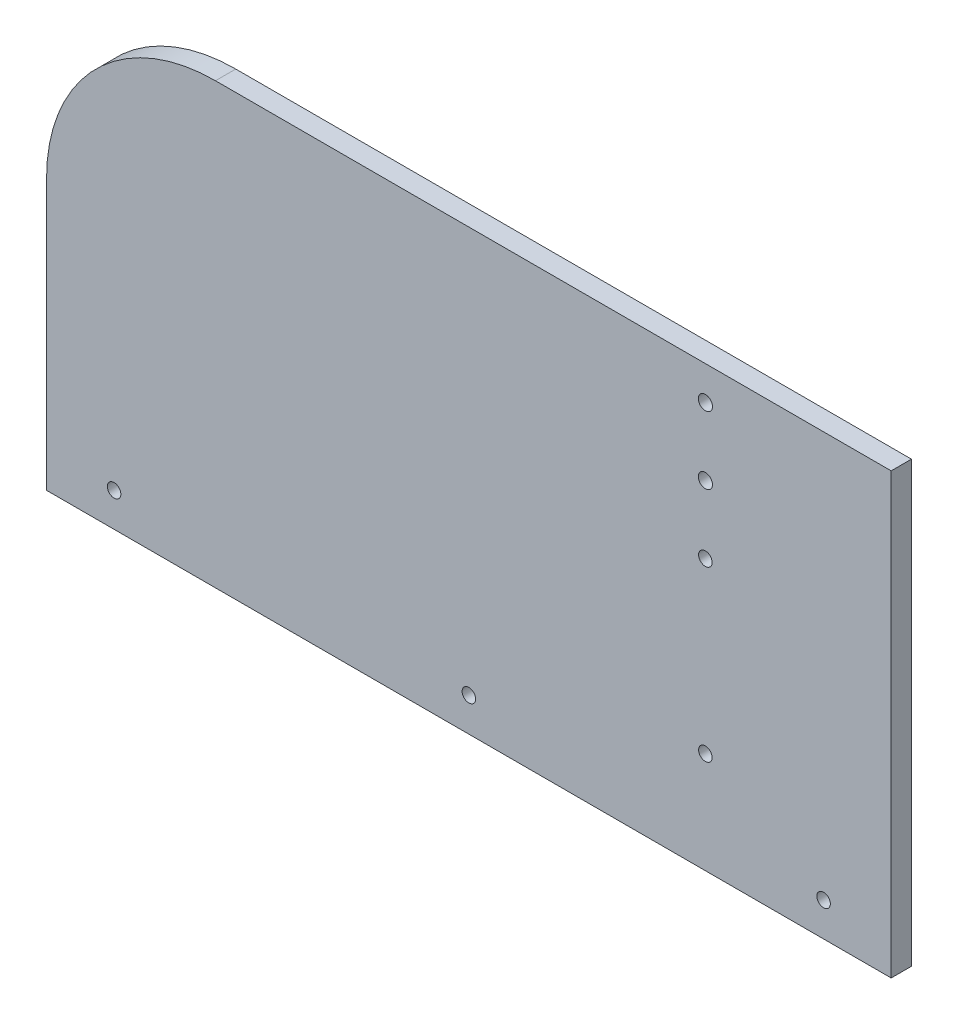
ISO-10303-21;
HEADER;
FILE_DESCRIPTION(('STEP AP214'),'2;1');
FILE_NAME('part.step','',(''),(''),'','','');
FILE_SCHEMA(('AUTOMOTIVE_DESIGN { 1 0 10303 214 1 1 1 1 }'));
ENDSEC;
DATA;
#1=APPLICATION_CONTEXT('core data for automotive mechanical design processes');
#2=APPLICATION_PROTOCOL_DEFINITION('international standard','automotive_design',2000,#1);
#3=PRODUCT_CONTEXT('',#1,'mechanical');
#4=PRODUCT('Part','Part','',(#3));
#5=PRODUCT_RELATED_PRODUCT_CATEGORY('part','',(#4));
#6=PRODUCT_DEFINITION_FORMATION('','',#4);
#7=PRODUCT_DEFINITION_CONTEXT('part definition',#1,'design');
#8=PRODUCT_DEFINITION('design','',#6,#7);
#9=PRODUCT_DEFINITION_SHAPE('','',#8);
#10=(LENGTH_UNIT() NAMED_UNIT(*) SI_UNIT(.MILLI.,.METRE.));
#11=(NAMED_UNIT(*) PLANE_ANGLE_UNIT() SI_UNIT($,.RADIAN.));
#12=(NAMED_UNIT(*) SI_UNIT($,.STERADIAN.) SOLID_ANGLE_UNIT());
#13=UNCERTAINTY_MEASURE_WITH_UNIT(LENGTH_MEASURE(1.E-05),#10,'distance_accuracy_value','');
#14=(GEOMETRIC_REPRESENTATION_CONTEXT(3) GLOBAL_UNCERTAINTY_ASSIGNED_CONTEXT((#13)) GLOBAL_UNIT_ASSIGNED_CONTEXT((#10,
#11,#12)) REPRESENTATION_CONTEXT('',''));
#15=CARTESIAN_POINT('',(0.,0.,0.));
#16=DIRECTION('',(0.,0.,1.));
#17=DIRECTION('',(1.,0.,0.));
#18=AXIS2_PLACEMENT_3D('',#15,#16,#17);
#19=CARTESIAN_POINT('',(125.,65.,6.));
#20=DIRECTION('',(-1.,0.,0.));
#21=DIRECTION('',(0.,-1.,0.));
#22=AXIS2_PLACEMENT_3D('',#19,#20,#21);
#23=PLANE('',#22);
#24=DIRECTION('',(0.,1.,0.));
#25=VECTOR('',#24,1.);
#26=CARTESIAN_POINT('',(125.,65.,0.));
#27=LINE('',#26,#25);
#28=CARTESIAN_POINT('',(125.,-65.,0.));
#29=VERTEX_POINT('',#28);
#30=CARTESIAN_POINT('',(125.,65.,0.));
#31=VERTEX_POINT('',#30);
#32=EDGE_CURVE('E98',#29,#31,#27,.T.);
#33=ORIENTED_EDGE('',*,*,#32,.T.);
#34=DIRECTION('',(0.,0.,-1.));
#35=VECTOR('',#34,1.);
#36=CARTESIAN_POINT('',(125.,65.,6.));
#37=LINE('',#36,#35);
#38=CARTESIAN_POINT('',(125.,65.,6.));
#39=VERTEX_POINT('',#38);
#40=EDGE_CURVE('E81',#39,#31,#37,.T.);
#41=ORIENTED_EDGE('',*,*,#40,.F.);
#42=DIRECTION('',(0.,1.,0.));
#43=VECTOR('',#42,1.);
#44=CARTESIAN_POINT('',(125.,65.,6.));
#45=LINE('',#44,#43);
#46=CARTESIAN_POINT('',(125.,-65.,6.));
#47=VERTEX_POINT('',#46);
#48=EDGE_CURVE('E86',#47,#39,#45,.T.);
#49=ORIENTED_EDGE('',*,*,#48,.F.);
#50=DIRECTION('',(0.,0.,-1.));
#51=VECTOR('',#50,1.);
#52=CARTESIAN_POINT('',(125.,-65.,6.));
#53=LINE('',#52,#51);
#54=EDGE_CURVE('E105',#47,#29,#53,.T.);
#55=ORIENTED_EDGE('',*,*,#54,.T.);
#56=EDGE_LOOP('',(#33,#41,#49,#55));
#57=FACE_BOUND('',#56,.T.);
#58=ADVANCED_FACE('F32',(#57),#23,.F.);
#59=CARTESIAN_POINT('',(-125.,65.,6.));
#60=DIRECTION('',(0.,-1.,0.));
#61=DIRECTION('',(0.,0.,-1.));
#62=AXIS2_PLACEMENT_3D('',#59,#60,#61);
#63=PLANE('',#62);
#64=DIRECTION('',(-1.,0.,0.));
#65=VECTOR('',#64,1.);
#66=CARTESIAN_POINT('',(-125.,65.,0.));
#67=LINE('',#66,#65);
#68=CARTESIAN_POINT('',(-74.9999999999999,65.,0.));
#69=VERTEX_POINT('',#68);
#70=EDGE_CURVE('E235',#31,#69,#67,.T.);
#71=ORIENTED_EDGE('',*,*,#70,.T.);
#72=DIRECTION('',(0.,0.,-1.));
#73=VECTOR('',#72,1.);
#74=CARTESIAN_POINT('',(-74.9999999999999,65.,6.));
#75=LINE('',#74,#73);
#76=CARTESIAN_POINT('',(-74.9999999999999,65.,6.));
#77=VERTEX_POINT('',#76);
#78=EDGE_CURVE('E47',#69,#77,#75,.F.);
#79=ORIENTED_EDGE('',*,*,#78,.T.);
#80=DIRECTION('',(-1.,0.,0.));
#81=VECTOR('',#80,1.);
#82=CARTESIAN_POINT('',(-125.,65.,6.));
#83=LINE('',#82,#81);
#84=EDGE_CURVE('E77',#39,#77,#83,.T.);
#85=ORIENTED_EDGE('',*,*,#84,.F.);
#86=ORIENTED_EDGE('',*,*,#40,.T.);
#87=EDGE_LOOP('',(#71,#79,#85,#86));
#88=FACE_BOUND('',#87,.T.);
#89=ADVANCED_FACE('F79',(#88),#63,.F.);
#90=CARTESIAN_POINT('',(-125.,65.,6.));
#91=DIRECTION('',(1.,0.,0.));
#92=DIRECTION('',(0.,1.,0.));
#93=AXIS2_PLACEMENT_3D('',#90,#91,#92);
#94=PLANE('',#93);
#95=DIRECTION('',(0.,-1.,0.));
#96=VECTOR('',#95,1.);
#97=CARTESIAN_POINT('',(-125.,65.,6.));
#98=LINE('',#97,#96);
#99=CARTESIAN_POINT('',(-125.,15.,6.));
#100=VERTEX_POINT('',#99);
#101=CARTESIAN_POINT('',(-125.,-65.,6.));
#102=VERTEX_POINT('',#101);
#103=EDGE_CURVE('E85',#100,#102,#98,.T.);
#104=ORIENTED_EDGE('',*,*,#103,.F.);
#105=DIRECTION('',(0.,0.,-1.));
#106=VECTOR('',#105,1.);
#107=CARTESIAN_POINT('',(-125.,15.,6.));
#108=LINE('',#107,#106);
#109=CARTESIAN_POINT('',(-125.,15.,0.));
#110=VERTEX_POINT('',#109);
#111=EDGE_CURVE('E99',#100,#110,#108,.T.);
#112=ORIENTED_EDGE('',*,*,#111,.T.);
#113=DIRECTION('',(0.,-1.,0.));
#114=VECTOR('',#113,1.);
#115=CARTESIAN_POINT('',(-125.,65.,0.));
#116=LINE('',#115,#114);
#117=CARTESIAN_POINT('',(-125.,-65.,0.));
#118=VERTEX_POINT('',#117);
#119=EDGE_CURVE('E237',#110,#118,#116,.T.);
#120=ORIENTED_EDGE('',*,*,#119,.T.);
#121=DIRECTION('',(0.,0.,-1.));
#122=VECTOR('',#121,1.);
#123=CARTESIAN_POINT('',(-125.,-65.,6.));
#124=LINE('',#123,#122);
#125=EDGE_CURVE('E100',#102,#118,#124,.T.);
#126=ORIENTED_EDGE('',*,*,#125,.F.);
#127=EDGE_LOOP('',(#104,#112,#120,#126));
#128=FACE_BOUND('',#127,.T.);
#129=ADVANCED_FACE('F172',(#128),#94,.F.);
#130=CARTESIAN_POINT('',(-125.,-65.,6.));
#131=DIRECTION('',(0.,1.,0.));
#132=DIRECTION('',(0.,0.,1.));
#133=AXIS2_PLACEMENT_3D('',#130,#131,#132);
#134=PLANE('',#133);
#135=DIRECTION('',(1.,0.,0.));
#136=VECTOR('',#135,1.);
#137=CARTESIAN_POINT('',(-125.,-65.,0.));
#138=LINE('',#137,#136);
#139=EDGE_CURVE('E95',#118,#29,#138,.T.);
#140=ORIENTED_EDGE('',*,*,#139,.T.);
#141=ORIENTED_EDGE('',*,*,#54,.F.);
#142=DIRECTION('',(1.,0.,0.));
#143=VECTOR('',#142,1.);
#144=CARTESIAN_POINT('',(-125.,-65.,6.));
#145=LINE('',#144,#143);
#146=EDGE_CURVE('E91',#102,#47,#145,.T.);
#147=ORIENTED_EDGE('',*,*,#146,.F.);
#148=ORIENTED_EDGE('',*,*,#125,.T.);
#149=EDGE_LOOP('',(#140,#141,#147,#148));
#150=FACE_BOUND('',#149,.T.);
#151=ADVANCED_FACE('F245',(#150),#134,.F.);
#152=CARTESIAN_POINT('',(0.,0.,6.));
#153=DIRECTION('',(0.,0.,1.));
#154=DIRECTION('',(1.,0.,0.));
#155=AXIS2_PLACEMENT_3D('',#152,#153,#154);
#156=PLANE('',#155);
#157=CARTESIAN_POINT('',(70.0000000000001,15.0000000000001,6.));
#158=DIRECTION('',(0.,0.,1.));
#159=DIRECTION('',(1.,0.,0.));
#160=AXIS2_PLACEMENT_3D('',#157,#158,#159);
#161=CIRCLE('',#160,2.);
#162=CARTESIAN_POINT('',(72.0000000000001,15.0000000000001,6.));
#163=VERTEX_POINT('',#162);
#164=EDGE_CURVE('E212',#163,#163,#161,.F.);
#165=ORIENTED_EDGE('',*,*,#164,.T.);
#166=EDGE_LOOP('',(#165));
#167=FACE_BOUND('',#166,.T.);
#168=CARTESIAN_POINT('',(70.0000000000001,-34.9999999999999,6.));
#169=DIRECTION('',(0.,0.,1.));
#170=DIRECTION('',(1.,0.,0.));
#171=AXIS2_PLACEMENT_3D('',#168,#169,#170);
#172=CIRCLE('',#171,2.);
#173=CARTESIAN_POINT('',(72.0000000000001,-34.9999999999999,6.));
#174=VERTEX_POINT('',#173);
#175=EDGE_CURVE('E210',#174,#174,#172,.F.);
#176=ORIENTED_EDGE('',*,*,#175,.T.);
#177=EDGE_LOOP('',(#176));
#178=FACE_BOUND('',#177,.T.);
#179=CARTESIAN_POINT('',(70.0000000000001,55.0000000000001,6.));
#180=DIRECTION('',(0.,0.,1.));
#181=DIRECTION('',(1.,0.,0.));
#182=AXIS2_PLACEMENT_3D('',#179,#180,#181);
#183=CIRCLE('',#182,2.09999999999999);
#184=CARTESIAN_POINT('',(72.1000000000001,55.0000000000001,6.));
#185=VERTEX_POINT('',#184);
#186=EDGE_CURVE('E218',#185,#185,#183,.F.);
#187=ORIENTED_EDGE('',*,*,#186,.T.);
#188=EDGE_LOOP('',(#187));
#189=FACE_BOUND('',#188,.T.);
#190=CARTESIAN_POINT('',(70.0000000000001,35.0000000000001,6.));
#191=DIRECTION('',(0.,0.,1.));
#192=DIRECTION('',(1.,0.,0.));
#193=AXIS2_PLACEMENT_3D('',#190,#191,#192);
#194=CIRCLE('',#193,2.09999999999999);
#195=CARTESIAN_POINT('',(72.1000000000001,35.0000000000001,6.));
#196=VERTEX_POINT('',#195);
#197=EDGE_CURVE('E215',#196,#196,#194,.F.);
#198=ORIENTED_EDGE('',*,*,#197,.T.);
#199=EDGE_LOOP('',(#198));
#200=FACE_BOUND('',#199,.T.);
#201=CARTESIAN_POINT('',(-105.,-55.,6.));
#202=DIRECTION('',(0.,0.,1.));
#203=DIRECTION('',(1.,0.,0.));
#204=AXIS2_PLACEMENT_3D('',#201,#202,#203);
#205=CIRCLE('',#204,2.);
#206=CARTESIAN_POINT('',(-103.,-55.,6.));
#207=VERTEX_POINT('',#206);
#208=EDGE_CURVE('E224',#207,#207,#205,.F.);
#209=ORIENTED_EDGE('',*,*,#208,.T.);
#210=EDGE_LOOP('',(#209));
#211=FACE_BOUND('',#210,.T.);
#212=CARTESIAN_POINT('',(0.,-55.,6.));
#213=DIRECTION('',(0.,0.,1.));
#214=DIRECTION('',(1.,0.,0.));
#215=AXIS2_PLACEMENT_3D('',#212,#213,#214);
#216=CIRCLE('',#215,2.);
#217=CARTESIAN_POINT('',(2.0000000000001,-55.,6.));
#218=VERTEX_POINT('',#217);
#219=EDGE_CURVE('E227',#218,#218,#216,.F.);
#220=ORIENTED_EDGE('',*,*,#219,.T.);
#221=EDGE_LOOP('',(#220));
#222=FACE_BOUND('',#221,.T.);
#223=CARTESIAN_POINT('',(105.,-55.,6.));
#224=DIRECTION('',(0.,0.,1.));
#225=DIRECTION('',(1.,0.,0.));
#226=AXIS2_PLACEMENT_3D('',#223,#224,#225);
#227=CIRCLE('',#226,2.);
#228=CARTESIAN_POINT('',(107.,-55.,6.));
#229=VERTEX_POINT('',#228);
#230=EDGE_CURVE('E221',#229,#229,#227,.F.);
#231=ORIENTED_EDGE('',*,*,#230,.T.);
#232=EDGE_LOOP('',(#231));
#233=FACE_BOUND('',#232,.T.);
#234=ORIENTED_EDGE('',*,*,#84,.T.);
#235=CARTESIAN_POINT('',(-74.9999999999999,15.,6.));
#236=DIRECTION('',(0.,0.,1.));
#237=DIRECTION('',(1.,0.,0.));
#238=AXIS2_PLACEMENT_3D('',#235,#236,#237);
#239=CIRCLE('',#238,50.);
#240=EDGE_CURVE('E111',#77,#100,#239,.T.);
#241=ORIENTED_EDGE('',*,*,#240,.T.);
#242=ORIENTED_EDGE('',*,*,#103,.T.);
#243=ORIENTED_EDGE('',*,*,#146,.T.);
#244=ORIENTED_EDGE('',*,*,#48,.T.);
#245=EDGE_LOOP('',(#234,#241,#242,#243,#244));
#246=FACE_BOUND('',#245,.T.);
#247=ADVANCED_FACE('F89',(#167,#178,#189,#200,#211,#222,#233,#246),#156,.T.);
#248=CARTESIAN_POINT('',(0.,0.,0.));
#249=DIRECTION('',(0.,0.,1.));
#250=DIRECTION('',(1.,0.,0.));
#251=AXIS2_PLACEMENT_3D('',#248,#249,#250);
#252=PLANE('',#251);
#253=CARTESIAN_POINT('',(-105.,-55.,0.));
#254=DIRECTION('',(0.,0.,1.));
#255=DIRECTION('',(1.,0.,0.));
#256=AXIS2_PLACEMENT_3D('',#253,#254,#255);
#257=CIRCLE('',#256,4.3);
#258=CARTESIAN_POINT('',(-100.7,-55.,0.));
#259=VERTEX_POINT('',#258);
#260=EDGE_CURVE('E134',#259,#259,#257,.T.);
#261=ORIENTED_EDGE('',*,*,#260,.T.);
#262=EDGE_LOOP('',(#261));
#263=FACE_BOUND('',#262,.T.);
#264=CARTESIAN_POINT('',(0.,-55.,0.));
#265=DIRECTION('',(0.,0.,1.));
#266=DIRECTION('',(1.,0.,0.));
#267=AXIS2_PLACEMENT_3D('',#264,#265,#266);
#268=CIRCLE('',#267,4.3);
#269=CARTESIAN_POINT('',(4.3000000000001,-55.,0.));
#270=VERTEX_POINT('',#269);
#271=EDGE_CURVE('E131',#270,#270,#268,.T.);
#272=ORIENTED_EDGE('',*,*,#271,.T.);
#273=EDGE_LOOP('',(#272));
#274=FACE_BOUND('',#273,.T.);
#275=CARTESIAN_POINT('',(105.,-55.,0.));
#276=DIRECTION('',(0.,0.,1.));
#277=DIRECTION('',(1.,0.,0.));
#278=AXIS2_PLACEMENT_3D('',#275,#276,#277);
#279=CIRCLE('',#278,4.3);
#280=CARTESIAN_POINT('',(109.3,-55.,0.));
#281=VERTEX_POINT('',#280);
#282=EDGE_CURVE('E128',#281,#281,#279,.T.);
#283=ORIENTED_EDGE('',*,*,#282,.T.);
#284=EDGE_LOOP('',(#283));
#285=FACE_BOUND('',#284,.T.);
#286=CARTESIAN_POINT('',(70.0000000000001,-34.9999999999999,0.));
#287=DIRECTION('',(0.,0.,1.));
#288=DIRECTION('',(1.,0.,0.));
#289=AXIS2_PLACEMENT_3D('',#286,#287,#288);
#290=CIRCLE('',#289,4.29999999999997);
#291=CARTESIAN_POINT('',(74.3000000000001,-34.9999999999999,0.));
#292=VERTEX_POINT('',#291);
#293=EDGE_CURVE('E125',#292,#292,#290,.T.);
#294=ORIENTED_EDGE('',*,*,#293,.T.);
#295=EDGE_LOOP('',(#294));
#296=FACE_BOUND('',#295,.T.);
#297=CARTESIAN_POINT('',(70.0000000000001,15.0000000000001,0.));
#298=DIRECTION('',(0.,0.,1.));
#299=DIRECTION('',(1.,0.,0.));
#300=AXIS2_PLACEMENT_3D('',#297,#298,#299);
#301=CIRCLE('',#300,4.29999999999997);
#302=CARTESIAN_POINT('',(74.3000000000001,15.0000000000001,0.));
#303=VERTEX_POINT('',#302);
#304=EDGE_CURVE('E122',#303,#303,#301,.T.);
#305=ORIENTED_EDGE('',*,*,#304,.T.);
#306=EDGE_LOOP('',(#305));
#307=FACE_BOUND('',#306,.T.);
#308=CARTESIAN_POINT('',(70.0000000000001,35.0000000000001,0.));
#309=DIRECTION('',(0.,0.,1.));
#310=DIRECTION('',(1.,0.,0.));
#311=AXIS2_PLACEMENT_3D('',#308,#309,#310);
#312=CIRCLE('',#311,4.39999999999999);
#313=CARTESIAN_POINT('',(74.4000000000001,35.0000000000001,0.));
#314=VERTEX_POINT('',#313);
#315=EDGE_CURVE('E119',#314,#314,#312,.T.);
#316=ORIENTED_EDGE('',*,*,#315,.T.);
#317=EDGE_LOOP('',(#316));
#318=FACE_BOUND('',#317,.T.);
#319=CARTESIAN_POINT('',(70.0000000000001,55.0000000000001,0.));
#320=DIRECTION('',(0.,0.,1.));
#321=DIRECTION('',(1.,0.,0.));
#322=AXIS2_PLACEMENT_3D('',#319,#320,#321);
#323=CIRCLE('',#322,4.39999999999999);
#324=CARTESIAN_POINT('',(74.4000000000001,55.0000000000001,0.));
#325=VERTEX_POINT('',#324);
#326=EDGE_CURVE('E116',#325,#325,#323,.T.);
#327=ORIENTED_EDGE('',*,*,#326,.T.);
#328=EDGE_LOOP('',(#327));
#329=FACE_BOUND('',#328,.T.);
#330=ORIENTED_EDGE('',*,*,#119,.F.);
#331=CARTESIAN_POINT('',(-74.9999999999999,15.,0.));
#332=DIRECTION('',(0.,0.,1.));
#333=DIRECTION('',(1.,0.,0.));
#334=AXIS2_PLACEMENT_3D('',#331,#332,#333);
#335=CIRCLE('',#334,50.);
#336=EDGE_CURVE('E55',#110,#69,#335,.F.);
#337=ORIENTED_EDGE('',*,*,#336,.T.);
#338=ORIENTED_EDGE('',*,*,#70,.F.);
#339=ORIENTED_EDGE('',*,*,#32,.F.);
#340=ORIENTED_EDGE('',*,*,#139,.F.);
#341=EDGE_LOOP('',(#330,#337,#338,#339,#340));
#342=FACE_BOUND('',#341,.T.);
#343=ADVANCED_FACE('F180',(#263,#274,#285,#296,#307,#318,#329,#342),#252,.F.);
#344=CARTESIAN_POINT('',(-74.9999999999999,15.,6.));
#345=DIRECTION('',(0.,0.,-1.));
#346=DIRECTION('',(-1.,0.,0.));
#347=AXIS2_PLACEMENT_3D('',#344,#345,#346);
#348=CYLINDRICAL_SURFACE('',#347,50.);
#349=ORIENTED_EDGE('',*,*,#240,.F.);
#350=ORIENTED_EDGE('',*,*,#78,.F.);
#351=ORIENTED_EDGE('',*,*,#336,.F.);
#352=ORIENTED_EDGE('',*,*,#111,.F.);
#353=EDGE_LOOP('',(#349,#350,#351,#352));
#354=FACE_BOUND('',#353,.T.);
#355=ADVANCED_FACE('F176',(#354),#348,.T.);
#356=CARTESIAN_POINT('',(105.,-55.,11.6568542494924));
#357=DIRECTION('',(0.,0.,-1.));
#358=DIRECTION('',(-1.,0.,0.));
#359=AXIS2_PLACEMENT_3D('',#356,#357,#358);
#360=CYLINDRICAL_SURFACE('',#359,2.);
#361=CARTESIAN_POINT('',(105.,-55.,2.30000000000001));
#362=DIRECTION('',(0.,0.,1.));
#363=DIRECTION('',(1.,0.,0.));
#364=AXIS2_PLACEMENT_3D('',#361,#362,#363);
#365=CIRCLE('',#364,2.);
#366=CARTESIAN_POINT('',(107.,-55.,2.30000000000001));
#367=VERTEX_POINT('',#366);
#368=EDGE_CURVE('E140',#367,#367,#365,.F.);
#369=ORIENTED_EDGE('',*,*,#368,.T.);
#370=EDGE_LOOP('',(#369));
#371=FACE_BOUND('',#370,.T.);
#372=ORIENTED_EDGE('',*,*,#230,.F.);
#373=EDGE_LOOP('',(#372));
#374=FACE_BOUND('',#373,.T.);
#375=ADVANCED_FACE('F179',(#371,#374),#360,.F.);
#376=CARTESIAN_POINT('',(0.,-55.,11.6568542494924));
#377=DIRECTION('',(0.,0.,-1.));
#378=DIRECTION('',(-1.,0.,0.));
#379=AXIS2_PLACEMENT_3D('',#376,#377,#378);
#380=CYLINDRICAL_SURFACE('',#379,2.);
#381=CARTESIAN_POINT('',(0.,-55.,2.30000000000001));
#382=DIRECTION('',(0.,0.,1.));
#383=DIRECTION('',(1.,0.,0.));
#384=AXIS2_PLACEMENT_3D('',#381,#382,#383);
#385=CIRCLE('',#384,2.);
#386=CARTESIAN_POINT('',(2.0000000000001,-55.,2.30000000000001));
#387=VERTEX_POINT('',#386);
#388=EDGE_CURVE('E137',#387,#387,#385,.F.);
#389=ORIENTED_EDGE('',*,*,#388,.T.);
#390=EDGE_LOOP('',(#389));
#391=FACE_BOUND('',#390,.T.);
#392=ORIENTED_EDGE('',*,*,#219,.F.);
#393=EDGE_LOOP('',(#392));
#394=FACE_BOUND('',#393,.T.);
#395=ADVANCED_FACE('F260',(#391,#394),#380,.F.);
#396=CARTESIAN_POINT('',(-105.,-55.,11.6568542494924));
#397=DIRECTION('',(0.,0.,-1.));
#398=DIRECTION('',(-1.,0.,0.));
#399=AXIS2_PLACEMENT_3D('',#396,#397,#398);
#400=CYLINDRICAL_SURFACE('',#399,2.);
#401=CARTESIAN_POINT('',(-105.,-55.,2.30000000000001));
#402=DIRECTION('',(0.,0.,1.));
#403=DIRECTION('',(1.,0.,0.));
#404=AXIS2_PLACEMENT_3D('',#401,#402,#403);
#405=CIRCLE('',#404,2.);
#406=CARTESIAN_POINT('',(-103.,-55.,2.30000000000001));
#407=VERTEX_POINT('',#406);
#408=EDGE_CURVE('E113',#407,#407,#405,.F.);
#409=ORIENTED_EDGE('',*,*,#408,.T.);
#410=EDGE_LOOP('',(#409));
#411=FACE_BOUND('',#410,.T.);
#412=ORIENTED_EDGE('',*,*,#208,.F.);
#413=EDGE_LOOP('',(#412));
#414=FACE_BOUND('',#413,.T.);
#415=ADVANCED_FACE('F264',(#411,#414),#400,.F.);
#416=CARTESIAN_POINT('',(70.0000000000001,35.0000000000001,11.939696961967));
#417=DIRECTION('',(0.,0.,-1.));
#418=DIRECTION('',(-1.,0.,0.));
#419=AXIS2_PLACEMENT_3D('',#416,#417,#418);
#420=CYLINDRICAL_SURFACE('',#419,2.09999999999999);
#421=CARTESIAN_POINT('',(70.0000000000001,35.0000000000001,2.30000000000001));
#422=DIRECTION('',(0.,0.,1.));
#423=DIRECTION('',(1.,0.,0.));
#424=AXIS2_PLACEMENT_3D('',#421,#422,#423);
#425=CIRCLE('',#424,2.09999999999999);
#426=CARTESIAN_POINT('',(72.1000000000001,35.0000000000001,2.30000000000001));
#427=VERTEX_POINT('',#426);
#428=EDGE_CURVE('E40',#427,#427,#425,.F.);
#429=ORIENTED_EDGE('',*,*,#428,.T.);
#430=EDGE_LOOP('',(#429));
#431=FACE_BOUND('',#430,.T.);
#432=ORIENTED_EDGE('',*,*,#197,.F.);
#433=EDGE_LOOP('',(#432));
#434=FACE_BOUND('',#433,.T.);
#435=ADVANCED_FACE('F151',(#431,#434),#420,.F.);
#436=CARTESIAN_POINT('',(70.0000000000001,55.0000000000001,11.939696961967));
#437=DIRECTION('',(0.,0.,-1.));
#438=DIRECTION('',(-1.,0.,0.));
#439=AXIS2_PLACEMENT_3D('',#436,#437,#438);
#440=CYLINDRICAL_SURFACE('',#439,2.09999999999999);
#441=CARTESIAN_POINT('',(70.0000000000001,55.0000000000001,2.30000000000001));
#442=DIRECTION('',(0.,0.,1.));
#443=DIRECTION('',(1.,0.,0.));
#444=AXIS2_PLACEMENT_3D('',#441,#442,#443);
#445=CIRCLE('',#444,2.09999999999999);
#446=CARTESIAN_POINT('',(72.1000000000001,55.0000000000001,2.30000000000001));
#447=VERTEX_POINT('',#446);
#448=EDGE_CURVE('E11',#447,#447,#445,.F.);
#449=ORIENTED_EDGE('',*,*,#448,.T.);
#450=EDGE_LOOP('',(#449));
#451=FACE_BOUND('',#450,.T.);
#452=ORIENTED_EDGE('',*,*,#186,.F.);
#453=EDGE_LOOP('',(#452));
#454=FACE_BOUND('',#453,.T.);
#455=ADVANCED_FACE('F206',(#451,#454),#440,.F.);
#456=CARTESIAN_POINT('',(70.0000000000001,-34.9999999999999,11.6568542494924));
#457=DIRECTION('',(0.,0.,-1.));
#458=DIRECTION('',(-1.,0.,0.));
#459=AXIS2_PLACEMENT_3D('',#456,#457,#458);
#460=CYLINDRICAL_SURFACE('',#459,2.);
#461=CARTESIAN_POINT('',(70.0000000000001,-34.9999999999999,2.29999999999995));
#462=DIRECTION('',(0.,0.,1.));
#463=DIRECTION('',(1.,0.,0.));
#464=AXIS2_PLACEMENT_3D('',#461,#462,#463);
#465=CIRCLE('',#464,2.);
#466=CARTESIAN_POINT('',(72.0000000000001,-34.9999999999999,2.29999999999995));
#467=VERTEX_POINT('',#466);
#468=EDGE_CURVE('E143',#467,#467,#465,.F.);
#469=ORIENTED_EDGE('',*,*,#468,.T.);
#470=EDGE_LOOP('',(#469));
#471=FACE_BOUND('',#470,.T.);
#472=ORIENTED_EDGE('',*,*,#175,.F.);
#473=EDGE_LOOP('',(#472));
#474=FACE_BOUND('',#473,.T.);
#475=ADVANCED_FACE('F203',(#471,#474),#460,.F.);
#476=CARTESIAN_POINT('',(70.0000000000001,15.0000000000001,11.6568542494924));
#477=DIRECTION('',(0.,0.,-1.));
#478=DIRECTION('',(-1.,0.,0.));
#479=AXIS2_PLACEMENT_3D('',#476,#477,#478);
#480=CYLINDRICAL_SURFACE('',#479,2.);
#481=CARTESIAN_POINT('',(70.0000000000001,15.0000000000001,2.29999999999995));
#482=DIRECTION('',(0.,0.,1.));
#483=DIRECTION('',(1.,0.,0.));
#484=AXIS2_PLACEMENT_3D('',#481,#482,#483);
#485=CIRCLE('',#484,2.);
#486=CARTESIAN_POINT('',(72.0000000000001,15.0000000000001,2.29999999999995));
#487=VERTEX_POINT('',#486);
#488=EDGE_CURVE('E146',#487,#487,#485,.F.);
#489=ORIENTED_EDGE('',*,*,#488,.T.);
#490=EDGE_LOOP('',(#489));
#491=FACE_BOUND('',#490,.T.);
#492=ORIENTED_EDGE('',*,*,#164,.F.);
#493=EDGE_LOOP('',(#492));
#494=FACE_BOUND('',#493,.T.);
#495=ADVANCED_FACE('F186',(#491,#494),#480,.F.);
#496=CARTESIAN_POINT('',(-105.,-55.,2.30000000000001));
#497=DIRECTION('',(0.,0.,-1.));
#498=DIRECTION('',(-1.,0.,0.));
#499=AXIS2_PLACEMENT_3D('',#496,#497,#498);
#500=CONICAL_SURFACE('',#499,2.,0.785398163397447);
#501=ORIENTED_EDGE('',*,*,#260,.F.);
#502=EDGE_LOOP('',(#501));
#503=FACE_BOUND('',#502,.T.);
#504=ORIENTED_EDGE('',*,*,#408,.F.);
#505=EDGE_LOOP('',(#504));
#506=FACE_BOUND('',#505,.T.);
#507=ADVANCED_FACE('F182',(#503,#506),#500,.F.);
#508=CARTESIAN_POINT('',(0.,-55.,2.30000000000001));
#509=DIRECTION('',(0.,0.,-1.));
#510=DIRECTION('',(-1.,0.,0.));
#511=AXIS2_PLACEMENT_3D('',#508,#509,#510);
#512=CONICAL_SURFACE('',#511,2.,0.785398163397447);
#513=ORIENTED_EDGE('',*,*,#271,.F.);
#514=EDGE_LOOP('',(#513));
#515=FACE_BOUND('',#514,.T.);
#516=ORIENTED_EDGE('',*,*,#388,.F.);
#517=EDGE_LOOP('',(#516));
#518=FACE_BOUND('',#517,.T.);
#519=ADVANCED_FACE('F185',(#515,#518),#512,.F.);
#520=CARTESIAN_POINT('',(105.,-55.,2.30000000000001));
#521=DIRECTION('',(0.,0.,-1.));
#522=DIRECTION('',(-1.,0.,0.));
#523=AXIS2_PLACEMENT_3D('',#520,#521,#522);
#524=CONICAL_SURFACE('',#523,2.,0.785398163397447);
#525=ORIENTED_EDGE('',*,*,#282,.F.);
#526=EDGE_LOOP('',(#525));
#527=FACE_BOUND('',#526,.T.);
#528=ORIENTED_EDGE('',*,*,#368,.F.);
#529=EDGE_LOOP('',(#528));
#530=FACE_BOUND('',#529,.T.);
#531=ADVANCED_FACE('F190',(#527,#530),#524,.F.);
#532=CARTESIAN_POINT('',(70.0000000000001,-34.9999999999999,2.29999999999995));
#533=DIRECTION('',(0.,0.,-1.));
#534=DIRECTION('',(-1.,0.,0.));
#535=AXIS2_PLACEMENT_3D('',#532,#533,#534);
#536=CONICAL_SURFACE('',#535,2.,0.785398163397453);
#537=ORIENTED_EDGE('',*,*,#293,.F.);
#538=EDGE_LOOP('',(#537));
#539=FACE_BOUND('',#538,.T.);
#540=ORIENTED_EDGE('',*,*,#468,.F.);
#541=EDGE_LOOP('',(#540));
#542=FACE_BOUND('',#541,.T.);
#543=ADVANCED_FACE('F163',(#539,#542),#536,.F.);
#544=CARTESIAN_POINT('',(70.0000000000001,15.0000000000001,2.29999999999995));
#545=DIRECTION('',(0.,0.,-1.));
#546=DIRECTION('',(-1.,0.,0.));
#547=AXIS2_PLACEMENT_3D('',#544,#545,#546);
#548=CONICAL_SURFACE('',#547,2.,0.785398163397453);
#549=ORIENTED_EDGE('',*,*,#304,.F.);
#550=EDGE_LOOP('',(#549));
#551=FACE_BOUND('',#550,.T.);
#552=ORIENTED_EDGE('',*,*,#488,.F.);
#553=EDGE_LOOP('',(#552));
#554=FACE_BOUND('',#553,.T.);
#555=ADVANCED_FACE('F156',(#551,#554),#548,.F.);
#556=CARTESIAN_POINT('',(70.0000000000001,35.0000000000001,2.30000000000001));
#557=DIRECTION('',(0.,0.,-1.));
#558=DIRECTION('',(-1.,0.,0.));
#559=AXIS2_PLACEMENT_3D('',#556,#557,#558);
#560=CONICAL_SURFACE('',#559,2.09999999999999,0.785398163397447);
#561=ORIENTED_EDGE('',*,*,#315,.F.);
#562=EDGE_LOOP('',(#561));
#563=FACE_BOUND('',#562,.T.);
#564=ORIENTED_EDGE('',*,*,#428,.F.);
#565=EDGE_LOOP('',(#564));
#566=FACE_BOUND('',#565,.T.);
#567=ADVANCED_FACE('F154',(#563,#566),#560,.F.);
#568=CARTESIAN_POINT('',(70.0000000000001,55.0000000000001,2.30000000000001));
#569=DIRECTION('',(0.,0.,-1.));
#570=DIRECTION('',(-1.,0.,0.));
#571=AXIS2_PLACEMENT_3D('',#568,#569,#570);
#572=CONICAL_SURFACE('',#571,2.09999999999999,0.785398163397447);
#573=ORIENTED_EDGE('',*,*,#326,.F.);
#574=EDGE_LOOP('',(#573));
#575=FACE_BOUND('',#574,.T.);
#576=ORIENTED_EDGE('',*,*,#448,.F.);
#577=EDGE_LOOP('',(#576));
#578=FACE_BOUND('',#577,.T.);
#579=ADVANCED_FACE('F34',(#575,#578),#572,.F.);
#580=CLOSED_SHELL('',(#58,#89,#129,#151,#247,#343,#355,#375,#395,#415,#435,#455,#475,#495,#507,
#519,#531,#543,#555,#567,#579));
#581=MANIFOLD_SOLID_BREP('B2',#580);
#582=ADVANCED_BREP_SHAPE_REPRESENTATION('',(#18,#581),#14);
#583=SHAPE_DEFINITION_REPRESENTATION(#9,#582);
ENDSEC;
END-ISO-10303-21;
